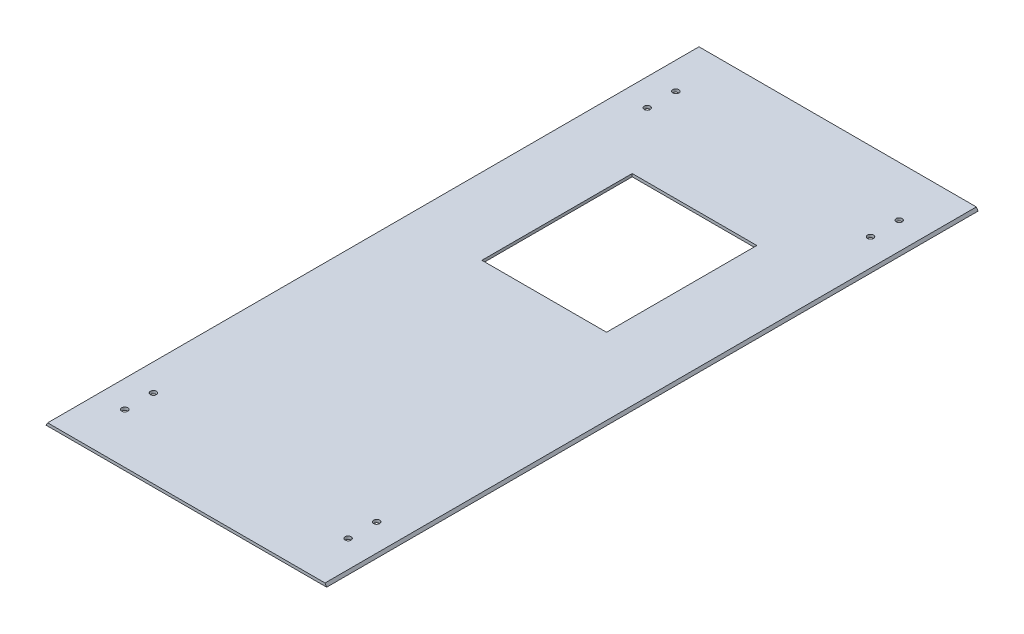
ISO-10303-21;
HEADER;
FILE_DESCRIPTION(('STEP AP214'),'2;1');
FILE_NAME('part.step','',(''),(''),'','','');
FILE_SCHEMA(('AUTOMOTIVE_DESIGN { 1 0 10303 214 1 1 1 1 }'));
ENDSEC;
DATA;
#1=APPLICATION_CONTEXT('core data for automotive mechanical design processes');
#2=APPLICATION_PROTOCOL_DEFINITION('international standard','automotive_design',2000,#1);
#3=PRODUCT_CONTEXT('',#1,'mechanical');
#4=PRODUCT('Part','Part','',(#3));
#5=PRODUCT_RELATED_PRODUCT_CATEGORY('part','',(#4));
#6=PRODUCT_DEFINITION_FORMATION('','',#4);
#7=PRODUCT_DEFINITION_CONTEXT('part definition',#1,'design');
#8=PRODUCT_DEFINITION('design','',#6,#7);
#9=PRODUCT_DEFINITION_SHAPE('','',#8);
#10=(LENGTH_UNIT() NAMED_UNIT(*) SI_UNIT(.MILLI.,.METRE.));
#11=(NAMED_UNIT(*) PLANE_ANGLE_UNIT() SI_UNIT($,.RADIAN.));
#12=(NAMED_UNIT(*) SI_UNIT($,.STERADIAN.) SOLID_ANGLE_UNIT());
#13=UNCERTAINTY_MEASURE_WITH_UNIT(LENGTH_MEASURE(1.E-05),#10,'distance_accuracy_value','');
#14=(GEOMETRIC_REPRESENTATION_CONTEXT(3) GLOBAL_UNCERTAINTY_ASSIGNED_CONTEXT((#13)) GLOBAL_UNIT_ASSIGNED_CONTEXT((#10,
#11,#12)) REPRESENTATION_CONTEXT('',''));
#15=CARTESIAN_POINT('',(0.,0.,0.));
#16=DIRECTION('',(0.,0.,1.));
#17=DIRECTION('',(1.,0.,0.));
#18=AXIS2_PLACEMENT_3D('',#15,#16,#17);
#19=CARTESIAN_POINT('',(-98.,-1.,-455.));
#20=DIRECTION('',(0.,-1.,0.));
#21=DIRECTION('',(0.,0.,-1.));
#22=AXIS2_PLACEMENT_3D('',#19,#20,#21);
#23=PLANE('',#22);
#24=DIRECTION('',(1.,0.,0.));
#25=VECTOR('',#24,1.);
#26=CARTESIAN_POINT('',(-43.5,-1.,-355.));
#27=LINE('',#26,#25);
#28=CARTESIAN_POINT('',(-43.5,-1.,-355.));
#29=VERTEX_POINT('',#28);
#30=CARTESIAN_POINT('',(43.57,-1.,-355.));
#31=VERTEX_POINT('',#30);
#32=EDGE_CURVE('E59',#29,#31,#27,.T.);
#33=ORIENTED_EDGE('',*,*,#32,.F.);
#34=DIRECTION('',(0.,0.,-1.));
#35=VECTOR('',#34,1.);
#36=CARTESIAN_POINT('',(-43.5,-1.,-250.));
#37=LINE('',#36,#35);
#38=CARTESIAN_POINT('',(-43.5,-1.,-250.));
#39=VERTEX_POINT('',#38);
#40=EDGE_CURVE('E126',#39,#29,#37,.T.);
#41=ORIENTED_EDGE('',*,*,#40,.F.);
#42=DIRECTION('',(1.,0.,0.));
#43=VECTOR('',#42,1.);
#44=CARTESIAN_POINT('',(-43.5,-1.,-250.));
#45=LINE('',#44,#43);
#46=CARTESIAN_POINT('',(43.57,-1.,-250.));
#47=VERTEX_POINT('',#46);
#48=EDGE_CURVE('E111',#39,#47,#45,.T.);
#49=ORIENTED_EDGE('',*,*,#48,.T.);
#50=DIRECTION('',(0.,0.,-1.));
#51=VECTOR('',#50,1.);
#52=CARTESIAN_POINT('',(43.57,-1.,-250.));
#53=LINE('',#52,#51);
#54=EDGE_CURVE('E120',#47,#31,#53,.T.);
#55=ORIENTED_EDGE('',*,*,#54,.T.);
#56=EDGE_LOOP('',(#33,#41,#49,#55));
#57=FACE_BOUND('',#56,.T.);
#58=CARTESIAN_POINT('',(78.,-1.,-420.));
#59=DIRECTION('',(0.,-1.,0.));
#60=DIRECTION('',(0.,0.,-1.));
#61=AXIS2_PLACEMENT_3D('',#58,#59,#60);
#62=CIRCLE('',#61,2.1);
#63=CARTESIAN_POINT('',(78.,-1.,-422.1));
#64=VERTEX_POINT('',#63);
#65=EDGE_CURVE('E169',#64,#64,#62,.T.);
#66=ORIENTED_EDGE('',*,*,#65,.F.);
#67=EDGE_LOOP('',(#66));
#68=FACE_BOUND('',#67,.T.);
#69=CARTESIAN_POINT('',(78.,-1.,-35.));
#70=DIRECTION('',(0.,-1.,0.));
#71=DIRECTION('',(0.,0.,1.));
#72=AXIS2_PLACEMENT_3D('',#69,#70,#71);
#73=CIRCLE('',#72,2.1);
#74=CARTESIAN_POINT('',(78.,-1.,-32.9));
#75=VERTEX_POINT('',#74);
#76=EDGE_CURVE('E160',#75,#75,#73,.T.);
#77=ORIENTED_EDGE('',*,*,#76,.F.);
#78=EDGE_LOOP('',(#77));
#79=FACE_BOUND('',#78,.T.);
#80=CARTESIAN_POINT('',(78.,-1.,-55.));
#81=DIRECTION('',(0.,-1.,0.));
#82=DIRECTION('',(0.,0.,1.));
#83=AXIS2_PLACEMENT_3D('',#80,#81,#82);
#84=CIRCLE('',#83,2.1);
#85=CARTESIAN_POINT('',(78.,-1.,-52.9));
#86=VERTEX_POINT('',#85);
#87=EDGE_CURVE('E185',#86,#86,#84,.T.);
#88=ORIENTED_EDGE('',*,*,#87,.F.);
#89=EDGE_LOOP('',(#88));
#90=FACE_BOUND('',#89,.T.);
#91=CARTESIAN_POINT('',(-78.,-1.,-55.));
#92=DIRECTION('',(0.,-1.,0.));
#93=DIRECTION('',(0.,0.,-1.));
#94=AXIS2_PLACEMENT_3D('',#91,#92,#93);
#95=CIRCLE('',#94,2.1);
#96=CARTESIAN_POINT('',(-78.,-1.,-57.1));
#97=VERTEX_POINT('',#96);
#98=EDGE_CURVE('E176',#97,#97,#95,.T.);
#99=ORIENTED_EDGE('',*,*,#98,.F.);
#100=EDGE_LOOP('',(#99));
#101=FACE_BOUND('',#100,.T.);
#102=CARTESIAN_POINT('',(78.,-1.,-400.));
#103=DIRECTION('',(0.,-1.,0.));
#104=DIRECTION('',(0.,0.,-1.));
#105=AXIS2_PLACEMENT_3D('',#102,#103,#104);
#106=CIRCLE('',#105,2.1);
#107=CARTESIAN_POINT('',(78.,-1.,-402.1));
#108=VERTEX_POINT('',#107);
#109=EDGE_CURVE('E136',#108,#108,#106,.T.);
#110=ORIENTED_EDGE('',*,*,#109,.F.);
#111=EDGE_LOOP('',(#110));
#112=FACE_BOUND('',#111,.T.);
#113=CARTESIAN_POINT('',(-78.,-1.,-400.));
#114=DIRECTION('',(0.,-1.,0.));
#115=DIRECTION('',(0.,0.,1.));
#116=AXIS2_PLACEMENT_3D('',#113,#114,#115);
#117=CIRCLE('',#116,2.1);
#118=CARTESIAN_POINT('',(-78.,-1.,-397.9));
#119=VERTEX_POINT('',#118);
#120=EDGE_CURVE('E145',#119,#119,#117,.T.);
#121=ORIENTED_EDGE('',*,*,#120,.F.);
#122=EDGE_LOOP('',(#121));
#123=FACE_BOUND('',#122,.T.);
#124=CARTESIAN_POINT('',(-78.,-1.,-420.));
#125=DIRECTION('',(0.,-1.,0.));
#126=DIRECTION('',(0.,0.,1.));
#127=AXIS2_PLACEMENT_3D('',#124,#125,#126);
#128=CIRCLE('',#127,2.1);
#129=CARTESIAN_POINT('',(-78.,-1.,-417.9));
#130=VERTEX_POINT('',#129);
#131=EDGE_CURVE('E153',#130,#130,#128,.T.);
#132=ORIENTED_EDGE('',*,*,#131,.F.);
#133=EDGE_LOOP('',(#132));
#134=FACE_BOUND('',#133,.T.);
#135=CARTESIAN_POINT('',(-78.,-1.,-35.));
#136=DIRECTION('',(0.,-1.,0.));
#137=DIRECTION('',(0.,0.,-1.));
#138=AXIS2_PLACEMENT_3D('',#135,#136,#137);
#139=CIRCLE('',#138,2.1);
#140=CARTESIAN_POINT('',(-78.,-1.,-37.1));
#141=VERTEX_POINT('',#140);
#142=EDGE_CURVE('E180',#141,#141,#139,.T.);
#143=ORIENTED_EDGE('',*,*,#142,.F.);
#144=EDGE_LOOP('',(#143));
#145=FACE_BOUND('',#144,.T.);
#146=DIRECTION('',(1.,0.,0.));
#147=VECTOR('',#146,1.);
#148=CARTESIAN_POINT('',(-98.,-1.,0.));
#149=LINE('',#148,#147);
#150=CARTESIAN_POINT('',(-98.,-1.,0.));
#151=VERTEX_POINT('',#150);
#152=CARTESIAN_POINT('',(98.07,-1.,0.));
#153=VERTEX_POINT('',#152);
#154=EDGE_CURVE('E196',#151,#153,#149,.T.);
#155=ORIENTED_EDGE('',*,*,#154,.F.);
#156=DIRECTION('',(0.,0.,1.));
#157=VECTOR('',#156,1.);
#158=CARTESIAN_POINT('',(-98.,-1.,-455.));
#159=LINE('',#158,#157);
#160=CARTESIAN_POINT('',(-98.,-1.,-455.));
#161=VERTEX_POINT('',#160);
#162=EDGE_CURVE('E232',#161,#151,#159,.T.);
#163=ORIENTED_EDGE('',*,*,#162,.F.);
#164=DIRECTION('',(1.,0.,0.));
#165=VECTOR('',#164,1.);
#166=CARTESIAN_POINT('',(-98.,-1.,-455.));
#167=LINE('',#166,#165);
#168=CARTESIAN_POINT('',(98.07,-1.,-455.));
#169=VERTEX_POINT('',#168);
#170=EDGE_CURVE('E200',#161,#169,#167,.T.);
#171=ORIENTED_EDGE('',*,*,#170,.T.);
#172=DIRECTION('',(0.,0.,1.));
#173=VECTOR('',#172,1.);
#174=CARTESIAN_POINT('',(98.07,-1.,-455.));
#175=LINE('',#174,#173);
#176=EDGE_CURVE('E217',#169,#153,#175,.T.);
#177=ORIENTED_EDGE('',*,*,#176,.T.);
#178=EDGE_LOOP('',(#155,#163,#171,#177));
#179=FACE_BOUND('',#178,.T.);
#180=ADVANCED_FACE('F45',(#57,#68,#79,#90,#101,#112,#123,#134,#145,#179),#23,.T.);
#181=CARTESIAN_POINT('',(-98.,-1.,-455.));
#182=DIRECTION('',(-0.866025403784441,0.499999999999996,0.));
#183=DIRECTION('',(-0.499999999999996,-0.866025403784441,0.));
#184=AXIS2_PLACEMENT_3D('',#181,#182,#183);
#185=PLANE('',#184);
#186=DIRECTION('',(-0.499999999999996,-0.866025403784441,0.));
#187=VECTOR('',#186,1.);
#188=CARTESIAN_POINT('',(-98.,-1.,0.));
#189=LINE('',#188,#187);
#190=CARTESIAN_POINT('',(-96.8452994616208,1.,0.));
#191=VERTEX_POINT('',#190);
#192=EDGE_CURVE('E205',#191,#151,#189,.T.);
#193=ORIENTED_EDGE('',*,*,#192,.F.);
#194=DIRECTION('',(0.,0.,1.));
#195=VECTOR('',#194,1.);
#196=CARTESIAN_POINT('',(-96.8452994616208,1.,-455.));
#197=LINE('',#196,#195);
#198=CARTESIAN_POINT('',(-96.8452994616208,1.,-455.));
#199=VERTEX_POINT('',#198);
#200=EDGE_CURVE('E236',#199,#191,#197,.T.);
#201=ORIENTED_EDGE('',*,*,#200,.F.);
#202=DIRECTION('',(-0.499999999999996,-0.866025403784441,0.));
#203=VECTOR('',#202,1.);
#204=CARTESIAN_POINT('',(-98.,-1.,-455.));
#205=LINE('',#204,#203);
#206=EDGE_CURVE('E213',#199,#161,#205,.T.);
#207=ORIENTED_EDGE('',*,*,#206,.T.);
#208=ORIENTED_EDGE('',*,*,#162,.T.);
#209=EDGE_LOOP('',(#193,#201,#207,#208));
#210=FACE_BOUND('',#209,.T.);
#211=ADVANCED_FACE('F269',(#210),#185,.T.);
#212=CARTESIAN_POINT('',(-96.8452994616208,1.,-455.));
#213=DIRECTION('',(0.,1.,0.));
#214=DIRECTION('',(0.,0.,1.));
#215=AXIS2_PLACEMENT_3D('',#212,#213,#214);
#216=PLANE('',#215);
#217=DIRECTION('',(-1.,0.,0.));
#218=VECTOR('',#217,1.);
#219=CARTESIAN_POINT('',(-96.8452994616208,1.,-355.));
#220=LINE('',#219,#218);
#221=CARTESIAN_POINT('',(43.57,1.,-355.));
#222=VERTEX_POINT('',#221);
#223=CARTESIAN_POINT('',(-43.5,1.,-355.));
#224=VERTEX_POINT('',#223);
#225=EDGE_CURVE('E11',#222,#224,#220,.T.);
#226=ORIENTED_EDGE('',*,*,#225,.F.);
#227=DIRECTION('',(0.,0.,1.));
#228=VECTOR('',#227,1.);
#229=CARTESIAN_POINT('',(43.57,1.,-455.));
#230=LINE('',#229,#228);
#231=CARTESIAN_POINT('',(43.57,1.,-250.));
#232=VERTEX_POINT('',#231);
#233=EDGE_CURVE('E235',#222,#232,#230,.T.);
#234=ORIENTED_EDGE('',*,*,#233,.T.);
#235=DIRECTION('',(-1.,0.,0.));
#236=VECTOR('',#235,1.);
#237=CARTESIAN_POINT('',(-96.8452994616208,1.,-250.));
#238=LINE('',#237,#236);
#239=CARTESIAN_POINT('',(-43.5,1.,-250.));
#240=VERTEX_POINT('',#239);
#241=EDGE_CURVE('E114',#232,#240,#238,.T.);
#242=ORIENTED_EDGE('',*,*,#241,.T.);
#243=DIRECTION('',(0.,0.,1.));
#244=VECTOR('',#243,1.);
#245=CARTESIAN_POINT('',(-43.5,1.,-455.));
#246=LINE('',#245,#244);
#247=EDGE_CURVE('E52',#224,#240,#246,.T.);
#248=ORIENTED_EDGE('',*,*,#247,.F.);
#249=EDGE_LOOP('',(#226,#234,#242,#248));
#250=FACE_BOUND('',#249,.T.);
#251=CARTESIAN_POINT('',(78.,1.,-420.));
#252=DIRECTION('',(0.,-1.,0.));
#253=DIRECTION('',(0.,0.,-1.));
#254=AXIS2_PLACEMENT_3D('',#251,#252,#253);
#255=CIRCLE('',#254,2.1);
#256=CARTESIAN_POINT('',(78.,1.,-422.1));
#257=VERTEX_POINT('',#256);
#258=EDGE_CURVE('E140',#257,#257,#255,.T.);
#259=ORIENTED_EDGE('',*,*,#258,.T.);
#260=EDGE_LOOP('',(#259));
#261=FACE_BOUND('',#260,.T.);
#262=CARTESIAN_POINT('',(78.,1.,-35.));
#263=DIRECTION('',(0.,-1.,0.));
#264=DIRECTION('',(0.,0.,1.));
#265=AXIS2_PLACEMENT_3D('',#262,#263,#264);
#266=CIRCLE('',#265,2.1);
#267=CARTESIAN_POINT('',(78.,1.,-32.9));
#268=VERTEX_POINT('',#267);
#269=EDGE_CURVE('E165',#268,#268,#266,.T.);
#270=ORIENTED_EDGE('',*,*,#269,.T.);
#271=EDGE_LOOP('',(#270));
#272=FACE_BOUND('',#271,.T.);
#273=CARTESIAN_POINT('',(78.,1.,-55.));
#274=DIRECTION('',(0.,-1.,0.));
#275=DIRECTION('',(0.,0.,1.));
#276=AXIS2_PLACEMENT_3D('',#273,#274,#275);
#277=CIRCLE('',#276,2.1);
#278=CARTESIAN_POINT('',(78.,1.,-52.9));
#279=VERTEX_POINT('',#278);
#280=EDGE_CURVE('E164',#279,#279,#277,.T.);
#281=ORIENTED_EDGE('',*,*,#280,.T.);
#282=EDGE_LOOP('',(#281));
#283=FACE_BOUND('',#282,.T.);
#284=CARTESIAN_POINT('',(-78.,1.,-55.));
#285=DIRECTION('',(0.,-1.,0.));
#286=DIRECTION('',(0.,0.,-1.));
#287=AXIS2_PLACEMENT_3D('',#284,#285,#286);
#288=CIRCLE('',#287,2.1);
#289=CARTESIAN_POINT('',(-78.,1.,-57.1));
#290=VERTEX_POINT('',#289);
#291=EDGE_CURVE('E181',#290,#290,#288,.T.);
#292=ORIENTED_EDGE('',*,*,#291,.T.);
#293=EDGE_LOOP('',(#292));
#294=FACE_BOUND('',#293,.T.);
#295=CARTESIAN_POINT('',(78.,1.,-400.));
#296=DIRECTION('',(0.,-1.,0.));
#297=DIRECTION('',(0.,0.,-1.));
#298=AXIS2_PLACEMENT_3D('',#295,#296,#297);
#299=CIRCLE('',#298,2.1);
#300=CARTESIAN_POINT('',(78.,1.,-402.1));
#301=VERTEX_POINT('',#300);
#302=EDGE_CURVE('E141',#301,#301,#299,.T.);
#303=ORIENTED_EDGE('',*,*,#302,.T.);
#304=EDGE_LOOP('',(#303));
#305=FACE_BOUND('',#304,.T.);
#306=CARTESIAN_POINT('',(-78.,1.,-400.));
#307=DIRECTION('',(0.,-1.,0.));
#308=DIRECTION('',(0.,0.,1.));
#309=AXIS2_PLACEMENT_3D('',#306,#307,#308);
#310=CIRCLE('',#309,2.1);
#311=CARTESIAN_POINT('',(-78.,1.,-397.9));
#312=VERTEX_POINT('',#311);
#313=EDGE_CURVE('E149',#312,#312,#310,.T.);
#314=ORIENTED_EDGE('',*,*,#313,.T.);
#315=EDGE_LOOP('',(#314));
#316=FACE_BOUND('',#315,.T.);
#317=CARTESIAN_POINT('',(-78.,1.,-420.));
#318=DIRECTION('',(0.,-1.,0.));
#319=DIRECTION('',(0.,0.,1.));
#320=AXIS2_PLACEMENT_3D('',#317,#318,#319);
#321=CIRCLE('',#320,2.1);
#322=CARTESIAN_POINT('',(-78.,1.,-417.9));
#323=VERTEX_POINT('',#322);
#324=EDGE_CURVE('E133',#323,#323,#321,.T.);
#325=ORIENTED_EDGE('',*,*,#324,.T.);
#326=EDGE_LOOP('',(#325));
#327=FACE_BOUND('',#326,.T.);
#328=CARTESIAN_POINT('',(-78.,1.,-35.));
#329=DIRECTION('',(0.,-1.,0.));
#330=DIRECTION('',(0.,0.,-1.));
#331=AXIS2_PLACEMENT_3D('',#328,#329,#330);
#332=CIRCLE('',#331,2.1);
#333=CARTESIAN_POINT('',(-78.,1.,-37.1));
#334=VERTEX_POINT('',#333);
#335=EDGE_CURVE('E192',#334,#334,#332,.T.);
#336=ORIENTED_EDGE('',*,*,#335,.T.);
#337=EDGE_LOOP('',(#336));
#338=FACE_BOUND('',#337,.T.);
#339=DIRECTION('',(-1.,0.,0.));
#340=VECTOR('',#339,1.);
#341=CARTESIAN_POINT('',(-96.8452994616208,1.,0.));
#342=LINE('',#341,#340);
#343=CARTESIAN_POINT('',(96.9152994616207,1.,0.));
#344=VERTEX_POINT('',#343);
#345=EDGE_CURVE('E225',#344,#191,#342,.T.);
#346=ORIENTED_EDGE('',*,*,#345,.F.);
#347=DIRECTION('',(0.,0.,1.));
#348=VECTOR('',#347,1.);
#349=CARTESIAN_POINT('',(96.9152994616207,1.,-455.));
#350=LINE('',#349,#348);
#351=CARTESIAN_POINT('',(96.9152994616207,1.,-455.));
#352=VERTEX_POINT('',#351);
#353=EDGE_CURVE('E239',#352,#344,#350,.T.);
#354=ORIENTED_EDGE('',*,*,#353,.F.);
#355=DIRECTION('',(-1.,0.,0.));
#356=VECTOR('',#355,1.);
#357=CARTESIAN_POINT('',(-96.8452994616208,1.,-455.));
#358=LINE('',#357,#356);
#359=EDGE_CURVE('E209',#352,#199,#358,.T.);
#360=ORIENTED_EDGE('',*,*,#359,.T.);
#361=ORIENTED_EDGE('',*,*,#200,.T.);
#362=EDGE_LOOP('',(#346,#354,#360,#361));
#363=FACE_BOUND('',#362,.T.);
#364=ADVANCED_FACE('F251',(#250,#261,#272,#283,#294,#305,#316,#327,#338,#363),#216,.T.);
#365=CARTESIAN_POINT('',(98.07,-1.,-455.));
#366=DIRECTION('',(0.866025403784441,0.499999999999996,0.));
#367=DIRECTION('',(-0.499999999999996,0.866025403784441,0.));
#368=AXIS2_PLACEMENT_3D('',#365,#366,#367);
#369=PLANE('',#368);
#370=DIRECTION('',(-0.499999999999996,0.866025403784441,0.));
#371=VECTOR('',#370,1.);
#372=CARTESIAN_POINT('',(98.07,-1.,0.));
#373=LINE('',#372,#371);
#374=EDGE_CURVE('E221',#153,#344,#373,.T.);
#375=ORIENTED_EDGE('',*,*,#374,.F.);
#376=ORIENTED_EDGE('',*,*,#176,.F.);
#377=DIRECTION('',(-0.499999999999996,0.866025403784441,0.));
#378=VECTOR('',#377,1.);
#379=CARTESIAN_POINT('',(98.07,-1.,-455.));
#380=LINE('',#379,#378);
#381=EDGE_CURVE('E204',#169,#352,#380,.T.);
#382=ORIENTED_EDGE('',*,*,#381,.T.);
#383=ORIENTED_EDGE('',*,*,#353,.T.);
#384=EDGE_LOOP('',(#375,#376,#382,#383));
#385=FACE_BOUND('',#384,.T.);
#386=ADVANCED_FACE('F278',(#385),#369,.T.);
#387=CARTESIAN_POINT('',(0.,0.,-455.));
#388=DIRECTION('',(0.,0.,1.));
#389=DIRECTION('',(1.,0.,0.));
#390=AXIS2_PLACEMENT_3D('',#387,#388,#389);
#391=PLANE('',#390);
#392=ORIENTED_EDGE('',*,*,#170,.F.);
#393=ORIENTED_EDGE('',*,*,#206,.F.);
#394=ORIENTED_EDGE('',*,*,#359,.F.);
#395=ORIENTED_EDGE('',*,*,#381,.F.);
#396=EDGE_LOOP('',(#392,#393,#394,#395));
#397=FACE_BOUND('',#396,.T.);
#398=ADVANCED_FACE('F285',(#397),#391,.F.);
#399=CARTESIAN_POINT('',(0.,0.,0.));
#400=DIRECTION('',(0.,0.,1.));
#401=DIRECTION('',(1.,0.,0.));
#402=AXIS2_PLACEMENT_3D('',#399,#400,#401);
#403=PLANE('',#402);
#404=ORIENTED_EDGE('',*,*,#154,.T.);
#405=ORIENTED_EDGE('',*,*,#374,.T.);
#406=ORIENTED_EDGE('',*,*,#345,.T.);
#407=ORIENTED_EDGE('',*,*,#192,.T.);
#408=EDGE_LOOP('',(#404,#405,#406,#407));
#409=FACE_BOUND('',#408,.T.);
#410=ADVANCED_FACE('F282',(#409),#403,.T.);
#411=CARTESIAN_POINT('',(-78.,1.,-35.));
#412=DIRECTION('',(0.,-1.,0.));
#413=DIRECTION('',(0.,0.,-1.));
#414=AXIS2_PLACEMENT_3D('',#411,#412,#413);
#415=CYLINDRICAL_SURFACE('',#414,2.1);
#416=ORIENTED_EDGE('',*,*,#335,.F.);
#417=EDGE_LOOP('',(#416));
#418=FACE_BOUND('',#417,.T.);
#419=ORIENTED_EDGE('',*,*,#142,.T.);
#420=EDGE_LOOP('',(#419));
#421=FACE_BOUND('',#420,.T.);
#422=ADVANCED_FACE('F301',(#418,#421),#415,.F.);
#423=CARTESIAN_POINT('',(-78.,1.,-420.));
#424=DIRECTION('',(0.,-1.,0.));
#425=DIRECTION('',(0.,0.,-1.));
#426=AXIS2_PLACEMENT_3D('',#423,#424,#425);
#427=CYLINDRICAL_SURFACE('',#426,2.1);
#428=ORIENTED_EDGE('',*,*,#324,.F.);
#429=EDGE_LOOP('',(#428));
#430=FACE_BOUND('',#429,.T.);
#431=ORIENTED_EDGE('',*,*,#131,.T.);
#432=EDGE_LOOP('',(#431));
#433=FACE_BOUND('',#432,.T.);
#434=ADVANCED_FACE('F304',(#430,#433),#427,.F.);
#435=CARTESIAN_POINT('',(-78.,1.,-400.));
#436=DIRECTION('',(0.,-1.,0.));
#437=DIRECTION('',(0.,0.,-1.));
#438=AXIS2_PLACEMENT_3D('',#435,#436,#437);
#439=CYLINDRICAL_SURFACE('',#438,2.1);
#440=ORIENTED_EDGE('',*,*,#313,.F.);
#441=EDGE_LOOP('',(#440));
#442=FACE_BOUND('',#441,.T.);
#443=ORIENTED_EDGE('',*,*,#120,.T.);
#444=EDGE_LOOP('',(#443));
#445=FACE_BOUND('',#444,.T.);
#446=ADVANCED_FACE('F309',(#442,#445),#439,.F.);
#447=CARTESIAN_POINT('',(78.,1.,-400.));
#448=DIRECTION('',(0.,-1.,0.));
#449=DIRECTION('',(0.,0.,-1.));
#450=AXIS2_PLACEMENT_3D('',#447,#448,#449);
#451=CYLINDRICAL_SURFACE('',#450,2.1);
#452=ORIENTED_EDGE('',*,*,#302,.F.);
#453=EDGE_LOOP('',(#452));
#454=FACE_BOUND('',#453,.T.);
#455=ORIENTED_EDGE('',*,*,#109,.T.);
#456=EDGE_LOOP('',(#455));
#457=FACE_BOUND('',#456,.T.);
#458=ADVANCED_FACE('F321',(#454,#457),#451,.F.);
#459=CARTESIAN_POINT('',(-78.,1.,-55.));
#460=DIRECTION('',(0.,-1.,0.));
#461=DIRECTION('',(0.,0.,-1.));
#462=AXIS2_PLACEMENT_3D('',#459,#460,#461);
#463=CYLINDRICAL_SURFACE('',#462,2.1);
#464=ORIENTED_EDGE('',*,*,#291,.F.);
#465=EDGE_LOOP('',(#464));
#466=FACE_BOUND('',#465,.T.);
#467=ORIENTED_EDGE('',*,*,#98,.T.);
#468=EDGE_LOOP('',(#467));
#469=FACE_BOUND('',#468,.T.);
#470=ADVANCED_FACE('F318',(#466,#469),#463,.F.);
#471=CARTESIAN_POINT('',(78.,1.,-55.));
#472=DIRECTION('',(0.,-1.,0.));
#473=DIRECTION('',(0.,0.,-1.));
#474=AXIS2_PLACEMENT_3D('',#471,#472,#473);
#475=CYLINDRICAL_SURFACE('',#474,2.1);
#476=ORIENTED_EDGE('',*,*,#280,.F.);
#477=EDGE_LOOP('',(#476));
#478=FACE_BOUND('',#477,.T.);
#479=ORIENTED_EDGE('',*,*,#87,.T.);
#480=EDGE_LOOP('',(#479));
#481=FACE_BOUND('',#480,.T.);
#482=ADVANCED_FACE('F315',(#478,#481),#475,.F.);
#483=CARTESIAN_POINT('',(78.,1.,-35.));
#484=DIRECTION('',(0.,-1.,0.));
#485=DIRECTION('',(0.,0.,-1.));
#486=AXIS2_PLACEMENT_3D('',#483,#484,#485);
#487=CYLINDRICAL_SURFACE('',#486,2.1);
#488=ORIENTED_EDGE('',*,*,#269,.F.);
#489=EDGE_LOOP('',(#488));
#490=FACE_BOUND('',#489,.T.);
#491=ORIENTED_EDGE('',*,*,#76,.T.);
#492=EDGE_LOOP('',(#491));
#493=FACE_BOUND('',#492,.T.);
#494=ADVANCED_FACE('F263',(#490,#493),#487,.F.);
#495=CARTESIAN_POINT('',(78.,1.,-420.));
#496=DIRECTION('',(0.,-1.,0.));
#497=DIRECTION('',(0.,0.,-1.));
#498=AXIS2_PLACEMENT_3D('',#495,#496,#497);
#499=CYLINDRICAL_SURFACE('',#498,2.1);
#500=ORIENTED_EDGE('',*,*,#258,.F.);
#501=EDGE_LOOP('',(#500));
#502=FACE_BOUND('',#501,.T.);
#503=ORIENTED_EDGE('',*,*,#65,.T.);
#504=EDGE_LOOP('',(#503));
#505=FACE_BOUND('',#504,.T.);
#506=ADVANCED_FACE('F255',(#502,#505),#499,.F.);
#507=CARTESIAN_POINT('',(-43.5,9.,-355.));
#508=DIRECTION('',(0.,0.,-1.));
#509=DIRECTION('',(-1.,0.,0.));
#510=AXIS2_PLACEMENT_3D('',#507,#508,#509);
#511=PLANE('',#510);
#512=ORIENTED_EDGE('',*,*,#225,.T.);
#513=DIRECTION('',(0.,-1.,0.));
#514=VECTOR('',#513,1.);
#515=CARTESIAN_POINT('',(-43.5,9.,-355.));
#516=LINE('',#515,#514);
#517=EDGE_CURVE('E131',#224,#29,#516,.T.);
#518=ORIENTED_EDGE('',*,*,#517,.T.);
#519=ORIENTED_EDGE('',*,*,#32,.T.);
#520=DIRECTION('',(0.,-1.,0.));
#521=VECTOR('',#520,1.);
#522=CARTESIAN_POINT('',(43.57,9.,-355.));
#523=LINE('',#522,#521);
#524=EDGE_CURVE('E117',#222,#31,#523,.T.);
#525=ORIENTED_EDGE('',*,*,#524,.F.);
#526=EDGE_LOOP('',(#512,#518,#519,#525));
#527=FACE_BOUND('',#526,.T.);
#528=ADVANCED_FACE('F253',(#527),#511,.F.);
#529=CARTESIAN_POINT('',(-43.5,9.,-250.));
#530=DIRECTION('',(-1.,0.,0.));
#531=DIRECTION('',(0.,0.,1.));
#532=AXIS2_PLACEMENT_3D('',#529,#530,#531);
#533=PLANE('',#532);
#534=ORIENTED_EDGE('',*,*,#247,.T.);
#535=DIRECTION('',(0.,-1.,0.));
#536=VECTOR('',#535,1.);
#537=CARTESIAN_POINT('',(-43.5,9.,-250.));
#538=LINE('',#537,#536);
#539=EDGE_CURVE('E116',#240,#39,#538,.T.);
#540=ORIENTED_EDGE('',*,*,#539,.T.);
#541=ORIENTED_EDGE('',*,*,#40,.T.);
#542=ORIENTED_EDGE('',*,*,#517,.F.);
#543=EDGE_LOOP('',(#534,#540,#541,#542));
#544=FACE_BOUND('',#543,.T.);
#545=ADVANCED_FACE('F248',(#544),#533,.F.);
#546=CARTESIAN_POINT('',(-43.5,9.,-250.));
#547=DIRECTION('',(0.,0.,-1.));
#548=DIRECTION('',(-1.,0.,0.));
#549=AXIS2_PLACEMENT_3D('',#546,#547,#548);
#550=PLANE('',#549);
#551=DIRECTION('',(0.,-1.,0.));
#552=VECTOR('',#551,1.);
#553=CARTESIAN_POINT('',(43.57,9.,-250.));
#554=LINE('',#553,#552);
#555=EDGE_CURVE('E67',#232,#47,#554,.T.);
#556=ORIENTED_EDGE('',*,*,#555,.T.);
#557=ORIENTED_EDGE('',*,*,#48,.F.);
#558=ORIENTED_EDGE('',*,*,#539,.F.);
#559=ORIENTED_EDGE('',*,*,#241,.F.);
#560=EDGE_LOOP('',(#556,#557,#558,#559));
#561=FACE_BOUND('',#560,.T.);
#562=ADVANCED_FACE('F108',(#561),#550,.T.);
#563=CARTESIAN_POINT('',(43.57,9.,-250.));
#564=DIRECTION('',(-1.,0.,0.));
#565=DIRECTION('',(0.,0.,1.));
#566=AXIS2_PLACEMENT_3D('',#563,#564,#565);
#567=PLANE('',#566);
#568=ORIENTED_EDGE('',*,*,#524,.T.);
#569=ORIENTED_EDGE('',*,*,#54,.F.);
#570=ORIENTED_EDGE('',*,*,#555,.F.);
#571=ORIENTED_EDGE('',*,*,#233,.F.);
#572=EDGE_LOOP('',(#568,#569,#570,#571));
#573=FACE_BOUND('',#572,.T.);
#574=ADVANCED_FACE('F121',(#573),#567,.T.);
#575=CLOSED_SHELL('',(#180,#211,#364,#386,#398,#410,#422,#434,#446,#458,#470,#482,#494,#506,
#528,#545,#562,#574));
#576=MANIFOLD_SOLID_BREP('B2',#575);
#577=ADVANCED_BREP_SHAPE_REPRESENTATION('',(#18,#576),#14);
#578=SHAPE_DEFINITION_REPRESENTATION(#9,#577);
ENDSEC;
END-ISO-10303-21;
